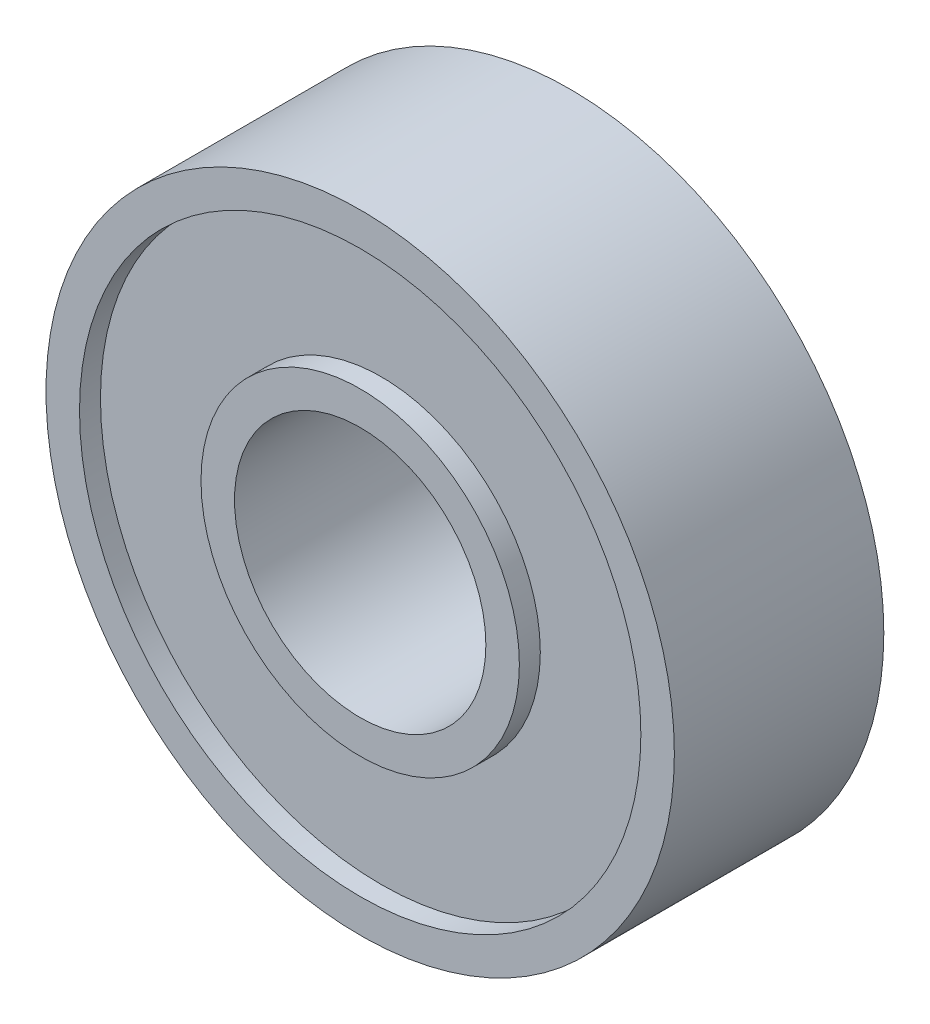
ISO-10303-21;
HEADER;
FILE_DESCRIPTION(('STEP AP214'),'2;1');
FILE_NAME('part.step','',(''),(''),'','','');
FILE_SCHEMA(('AUTOMOTIVE_DESIGN { 1 0 10303 214 1 1 1 1 }'));
ENDSEC;
DATA;
#1=APPLICATION_CONTEXT('core data for automotive mechanical design processes');
#2=APPLICATION_PROTOCOL_DEFINITION('international standard','automotive_design',2000,#1);
#3=PRODUCT_CONTEXT('',#1,'mechanical');
#4=PRODUCT('Part','Part','',(#3));
#5=PRODUCT_RELATED_PRODUCT_CATEGORY('part','',(#4));
#6=PRODUCT_DEFINITION_FORMATION('','',#4);
#7=PRODUCT_DEFINITION_CONTEXT('part definition',#1,'design');
#8=PRODUCT_DEFINITION('design','',#6,#7);
#9=PRODUCT_DEFINITION_SHAPE('','',#8);
#10=(LENGTH_UNIT() NAMED_UNIT(*) SI_UNIT(.MILLI.,.METRE.));
#11=(NAMED_UNIT(*) PLANE_ANGLE_UNIT() SI_UNIT($,.RADIAN.));
#12=(NAMED_UNIT(*) SI_UNIT($,.STERADIAN.) SOLID_ANGLE_UNIT());
#13=UNCERTAINTY_MEASURE_WITH_UNIT(LENGTH_MEASURE(1.E-05),#10,'distance_accuracy_value','');
#14=(GEOMETRIC_REPRESENTATION_CONTEXT(3) GLOBAL_UNCERTAINTY_ASSIGNED_CONTEXT((#13)) GLOBAL_UNIT_ASSIGNED_CONTEXT((#10,
#11,#12)) REPRESENTATION_CONTEXT('',''));
#15=CARTESIAN_POINT('',(0.,0.,0.));
#16=DIRECTION('',(0.,0.,1.));
#17=DIRECTION('',(1.,0.,0.));
#18=AXIS2_PLACEMENT_3D('',#15,#16,#17);
#19=CARTESIAN_POINT('',(0.,7.5,2.5));
#20=DIRECTION('',(0.,0.,-1.));
#21=DIRECTION('',(-1.,0.,0.));
#22=AXIS2_PLACEMENT_3D('',#19,#20,#21);
#23=PLANE('',#22);
#24=CARTESIAN_POINT('',(0.,0.,2.5));
#25=DIRECTION('',(0.,0.,1.));
#26=DIRECTION('',(1.,0.,0.));
#27=AXIS2_PLACEMENT_3D('',#24,#25,#26);
#28=CIRCLE('',#27,6.7);
#29=CARTESIAN_POINT('',(6.7,0.,2.5));
#30=VERTEX_POINT('',#29);
#31=EDGE_CURVE('E10',#30,#30,#28,.T.);
#32=ORIENTED_EDGE('',*,*,#31,.F.);
#33=EDGE_LOOP('',(#32));
#34=FACE_BOUND('',#33,.T.);
#35=CARTESIAN_POINT('',(0.,0.,2.5));
#36=DIRECTION('',(0.,0.,1.));
#37=DIRECTION('',(1.,0.,0.));
#38=AXIS2_PLACEMENT_3D('',#35,#36,#37);
#39=CIRCLE('',#38,7.5);
#40=CARTESIAN_POINT('',(7.5,0.,2.5));
#41=VERTEX_POINT('',#40);
#42=EDGE_CURVE('E72',#41,#41,#39,.T.);
#43=ORIENTED_EDGE('',*,*,#42,.T.);
#44=EDGE_LOOP('',(#43));
#45=FACE_BOUND('',#44,.T.);
#46=ADVANCED_FACE('F32',(#34,#45),#23,.F.);
#47=CARTESIAN_POINT('',(0.,0.,0.));
#48=DIRECTION('',(0.,0.,1.));
#49=DIRECTION('',(1.,0.,0.));
#50=AXIS2_PLACEMENT_3D('',#47,#48,#49);
#51=CYLINDRICAL_SURFACE('',#50,6.7);
#52=CARTESIAN_POINT('',(0.,0.,2.));
#53=DIRECTION('',(0.,0.,1.));
#54=DIRECTION('',(1.,0.,0.));
#55=AXIS2_PLACEMENT_3D('',#52,#53,#54);
#56=CIRCLE('',#55,6.7);
#57=CARTESIAN_POINT('',(6.7,0.,2.));
#58=VERTEX_POINT('',#57);
#59=EDGE_CURVE('E38',#58,#58,#56,.T.);
#60=ORIENTED_EDGE('',*,*,#59,.F.);
#61=EDGE_LOOP('',(#60));
#62=FACE_BOUND('',#61,.T.);
#63=ORIENTED_EDGE('',*,*,#31,.T.);
#64=EDGE_LOOP('',(#63));
#65=FACE_BOUND('',#64,.T.);
#66=ADVANCED_FACE('F133',(#62,#65),#51,.F.);
#67=CARTESIAN_POINT('',(0.,6.7,2.));
#68=DIRECTION('',(0.,0.,-1.));
#69=DIRECTION('',(-1.,0.,0.));
#70=AXIS2_PLACEMENT_3D('',#67,#68,#69);
#71=PLANE('',#70);
#72=CARTESIAN_POINT('',(0.,0.,2.));
#73=DIRECTION('',(0.,0.,1.));
#74=DIRECTION('',(1.,0.,0.));
#75=AXIS2_PLACEMENT_3D('',#72,#73,#74);
#76=CIRCLE('',#75,3.8);
#77=CARTESIAN_POINT('',(3.8,0.,2.));
#78=VERTEX_POINT('',#77);
#79=EDGE_CURVE('E42',#78,#78,#76,.T.);
#80=ORIENTED_EDGE('',*,*,#79,.F.);
#81=EDGE_LOOP('',(#80));
#82=FACE_BOUND('',#81,.T.);
#83=ORIENTED_EDGE('',*,*,#59,.T.);
#84=EDGE_LOOP('',(#83));
#85=FACE_BOUND('',#84,.T.);
#86=ADVANCED_FACE('F128',(#82,#85),#71,.F.);
#87=CARTESIAN_POINT('',(0.,0.,0.));
#88=DIRECTION('',(0.,0.,1.));
#89=DIRECTION('',(1.,0.,0.));
#90=AXIS2_PLACEMENT_3D('',#87,#88,#89);
#91=CYLINDRICAL_SURFACE('',#90,3.8);
#92=CARTESIAN_POINT('',(0.,0.,2.5));
#93=DIRECTION('',(0.,0.,1.));
#94=DIRECTION('',(1.,0.,0.));
#95=AXIS2_PLACEMENT_3D('',#92,#93,#94);
#96=CIRCLE('',#95,3.8);
#97=CARTESIAN_POINT('',(3.8,0.,2.5));
#98=VERTEX_POINT('',#97);
#99=EDGE_CURVE('E46',#98,#98,#96,.T.);
#100=ORIENTED_EDGE('',*,*,#99,.F.);
#101=EDGE_LOOP('',(#100));
#102=FACE_BOUND('',#101,.T.);
#103=ORIENTED_EDGE('',*,*,#79,.T.);
#104=EDGE_LOOP('',(#103));
#105=FACE_BOUND('',#104,.T.);
#106=ADVANCED_FACE('F122',(#102,#105),#91,.T.);
#107=CARTESIAN_POINT('',(0.,3.8,2.5));
#108=DIRECTION('',(0.,0.,-1.));
#109=DIRECTION('',(-1.,0.,0.));
#110=AXIS2_PLACEMENT_3D('',#107,#108,#109);
#111=PLANE('',#110);
#112=CARTESIAN_POINT('',(0.,0.,2.5));
#113=DIRECTION('',(0.,0.,1.));
#114=DIRECTION('',(1.,0.,0.));
#115=AXIS2_PLACEMENT_3D('',#112,#113,#114);
#116=CIRCLE('',#115,3.);
#117=CARTESIAN_POINT('',(3.,0.,2.5));
#118=VERTEX_POINT('',#117);
#119=EDGE_CURVE('E51',#118,#118,#116,.T.);
#120=ORIENTED_EDGE('',*,*,#119,.F.);
#121=EDGE_LOOP('',(#120));
#122=FACE_BOUND('',#121,.T.);
#123=ORIENTED_EDGE('',*,*,#99,.T.);
#124=EDGE_LOOP('',(#123));
#125=FACE_BOUND('',#124,.T.);
#126=ADVANCED_FACE('F116',(#122,#125),#111,.F.);
#127=CARTESIAN_POINT('',(0.,0.,0.));
#128=DIRECTION('',(0.,0.,1.));
#129=DIRECTION('',(1.,0.,0.));
#130=AXIS2_PLACEMENT_3D('',#127,#128,#129);
#131=CYLINDRICAL_SURFACE('',#130,3.);
#132=CARTESIAN_POINT('',(0.,0.,-2.5));
#133=DIRECTION('',(0.,0.,1.));
#134=DIRECTION('',(1.,0.,0.));
#135=AXIS2_PLACEMENT_3D('',#132,#133,#134);
#136=CIRCLE('',#135,3.);
#137=CARTESIAN_POINT('',(3.,0.,-2.5));
#138=VERTEX_POINT('',#137);
#139=EDGE_CURVE('E54',#138,#138,#136,.T.);
#140=ORIENTED_EDGE('',*,*,#139,.F.);
#141=EDGE_LOOP('',(#140));
#142=FACE_BOUND('',#141,.T.);
#143=ORIENTED_EDGE('',*,*,#119,.T.);
#144=EDGE_LOOP('',(#143));
#145=FACE_BOUND('',#144,.T.);
#146=ADVANCED_FACE('F110',(#142,#145),#131,.F.);
#147=CARTESIAN_POINT('',(0.,3.8,-2.5));
#148=DIRECTION('',(0.,0.,1.));
#149=DIRECTION('',(1.,0.,0.));
#150=AXIS2_PLACEMENT_3D('',#147,#148,#149);
#151=PLANE('',#150);
#152=CARTESIAN_POINT('',(0.,0.,-2.5));
#153=DIRECTION('',(0.,0.,1.));
#154=DIRECTION('',(1.,0.,0.));
#155=AXIS2_PLACEMENT_3D('',#152,#153,#154);
#156=CIRCLE('',#155,3.8);
#157=CARTESIAN_POINT('',(3.8,0.,-2.5));
#158=VERTEX_POINT('',#157);
#159=EDGE_CURVE('E57',#158,#158,#156,.T.);
#160=ORIENTED_EDGE('',*,*,#159,.F.);
#161=EDGE_LOOP('',(#160));
#162=FACE_BOUND('',#161,.T.);
#163=ORIENTED_EDGE('',*,*,#139,.T.);
#164=EDGE_LOOP('',(#163));
#165=FACE_BOUND('',#164,.T.);
#166=ADVANCED_FACE('F104',(#162,#165),#151,.F.);
#167=CARTESIAN_POINT('',(0.,0.,0.));
#168=DIRECTION('',(0.,0.,1.));
#169=DIRECTION('',(1.,0.,0.));
#170=AXIS2_PLACEMENT_3D('',#167,#168,#169);
#171=CYLINDRICAL_SURFACE('',#170,3.8);
#172=CARTESIAN_POINT('',(0.,0.,-2.));
#173=DIRECTION('',(0.,0.,1.));
#174=DIRECTION('',(1.,0.,0.));
#175=AXIS2_PLACEMENT_3D('',#172,#173,#174);
#176=CIRCLE('',#175,3.8);
#177=CARTESIAN_POINT('',(3.8,0.,-2.));
#178=VERTEX_POINT('',#177);
#179=EDGE_CURVE('E60',#178,#178,#176,.T.);
#180=ORIENTED_EDGE('',*,*,#179,.F.);
#181=EDGE_LOOP('',(#180));
#182=FACE_BOUND('',#181,.T.);
#183=ORIENTED_EDGE('',*,*,#159,.T.);
#184=EDGE_LOOP('',(#183));
#185=FACE_BOUND('',#184,.T.);
#186=ADVANCED_FACE('F98',(#182,#185),#171,.T.);
#187=CARTESIAN_POINT('',(0.,6.7,-2.));
#188=DIRECTION('',(0.,0.,1.));
#189=DIRECTION('',(1.,0.,0.));
#190=AXIS2_PLACEMENT_3D('',#187,#188,#189);
#191=PLANE('',#190);
#192=CARTESIAN_POINT('',(0.,0.,-2.));
#193=DIRECTION('',(0.,0.,1.));
#194=DIRECTION('',(1.,0.,0.));
#195=AXIS2_PLACEMENT_3D('',#192,#193,#194);
#196=CIRCLE('',#195,6.7);
#197=CARTESIAN_POINT('',(6.7,0.,-2.));
#198=VERTEX_POINT('',#197);
#199=EDGE_CURVE('E63',#198,#198,#196,.T.);
#200=ORIENTED_EDGE('',*,*,#199,.F.);
#201=EDGE_LOOP('',(#200));
#202=FACE_BOUND('',#201,.T.);
#203=ORIENTED_EDGE('',*,*,#179,.T.);
#204=EDGE_LOOP('',(#203));
#205=FACE_BOUND('',#204,.T.);
#206=ADVANCED_FACE('F92',(#202,#205),#191,.F.);
#207=CARTESIAN_POINT('',(0.,0.,0.));
#208=DIRECTION('',(0.,0.,1.));
#209=DIRECTION('',(1.,0.,0.));
#210=AXIS2_PLACEMENT_3D('',#207,#208,#209);
#211=CYLINDRICAL_SURFACE('',#210,6.7);
#212=CARTESIAN_POINT('',(0.,0.,-2.5));
#213=DIRECTION('',(0.,0.,1.));
#214=DIRECTION('',(1.,0.,0.));
#215=AXIS2_PLACEMENT_3D('',#212,#213,#214);
#216=CIRCLE('',#215,6.7);
#217=CARTESIAN_POINT('',(6.7,0.,-2.5));
#218=VERTEX_POINT('',#217);
#219=EDGE_CURVE('E66',#218,#218,#216,.T.);
#220=ORIENTED_EDGE('',*,*,#219,.F.);
#221=EDGE_LOOP('',(#220));
#222=FACE_BOUND('',#221,.T.);
#223=ORIENTED_EDGE('',*,*,#199,.T.);
#224=EDGE_LOOP('',(#223));
#225=FACE_BOUND('',#224,.T.);
#226=ADVANCED_FACE('F86',(#222,#225),#211,.F.);
#227=CARTESIAN_POINT('',(0.,7.5,-2.5));
#228=DIRECTION('',(0.,0.,1.));
#229=DIRECTION('',(1.,0.,0.));
#230=AXIS2_PLACEMENT_3D('',#227,#228,#229);
#231=PLANE('',#230);
#232=CARTESIAN_POINT('',(0.,0.,-2.5));
#233=DIRECTION('',(0.,0.,1.));
#234=DIRECTION('',(1.,0.,0.));
#235=AXIS2_PLACEMENT_3D('',#232,#233,#234);
#236=CIRCLE('',#235,7.5);
#237=CARTESIAN_POINT('',(7.5,0.,-2.5));
#238=VERTEX_POINT('',#237);
#239=EDGE_CURVE('E69',#238,#238,#236,.T.);
#240=ORIENTED_EDGE('',*,*,#239,.F.);
#241=EDGE_LOOP('',(#240));
#242=FACE_BOUND('',#241,.T.);
#243=ORIENTED_EDGE('',*,*,#219,.T.);
#244=EDGE_LOOP('',(#243));
#245=FACE_BOUND('',#244,.T.);
#246=ADVANCED_FACE('F80',(#242,#245),#231,.F.);
#247=CARTESIAN_POINT('',(0.,0.,0.));
#248=DIRECTION('',(0.,0.,1.));
#249=DIRECTION('',(1.,0.,0.));
#250=AXIS2_PLACEMENT_3D('',#247,#248,#249);
#251=CYLINDRICAL_SURFACE('',#250,7.5);
#252=ORIENTED_EDGE('',*,*,#42,.F.);
#253=EDGE_LOOP('',(#252));
#254=FACE_BOUND('',#253,.T.);
#255=ORIENTED_EDGE('',*,*,#239,.T.);
#256=EDGE_LOOP('',(#255));
#257=FACE_BOUND('',#256,.T.);
#258=ADVANCED_FACE('F77',(#254,#257),#251,.T.);
#259=CLOSED_SHELL('',(#46,#66,#86,#106,#126,#146,#166,#186,#206,#226,#246,#258));
#260=MANIFOLD_SOLID_BREP('B2',#259);
#261=ADVANCED_BREP_SHAPE_REPRESENTATION('',(#18,#260),#14);
#262=SHAPE_DEFINITION_REPRESENTATION(#9,#261);
ENDSEC;
END-ISO-10303-21;
